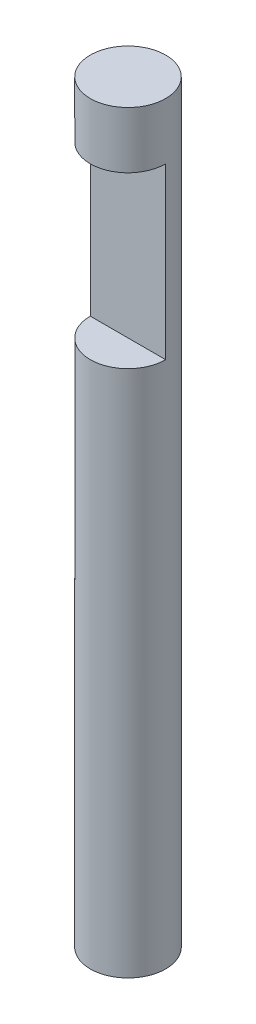
ISO-10303-21;
HEADER;
FILE_DESCRIPTION(('STEP AP214'),'2;1');
FILE_NAME('part.step','',(''),(''),'','','');
FILE_SCHEMA(('AUTOMOTIVE_DESIGN { 1 0 10303 214 1 1 1 1 }'));
ENDSEC;
DATA;
#1=APPLICATION_CONTEXT('core data for automotive mechanical design processes');
#2=APPLICATION_PROTOCOL_DEFINITION('international standard','automotive_design',2000,#1);
#3=PRODUCT_CONTEXT('',#1,'mechanical');
#4=PRODUCT('Part','Part','',(#3));
#5=PRODUCT_RELATED_PRODUCT_CATEGORY('part','',(#4));
#6=PRODUCT_DEFINITION_FORMATION('','',#4);
#7=PRODUCT_DEFINITION_CONTEXT('part definition',#1,'design');
#8=PRODUCT_DEFINITION('design','',#6,#7);
#9=PRODUCT_DEFINITION_SHAPE('','',#8);
#10=(LENGTH_UNIT() NAMED_UNIT(*) SI_UNIT(.MILLI.,.METRE.));
#11=(NAMED_UNIT(*) PLANE_ANGLE_UNIT() SI_UNIT($,.RADIAN.));
#12=(NAMED_UNIT(*) SI_UNIT($,.STERADIAN.) SOLID_ANGLE_UNIT());
#13=UNCERTAINTY_MEASURE_WITH_UNIT(LENGTH_MEASURE(1.E-05),#10,'distance_accuracy_value','');
#14=(GEOMETRIC_REPRESENTATION_CONTEXT(3) GLOBAL_UNCERTAINTY_ASSIGNED_CONTEXT((#13)) GLOBAL_UNIT_ASSIGNED_CONTEXT((#10,
#11,#12)) REPRESENTATION_CONTEXT('',''));
#15=CARTESIAN_POINT('',(0.,0.,0.));
#16=DIRECTION('',(0.,0.,1.));
#17=DIRECTION('',(1.,0.,0.));
#18=AXIS2_PLACEMENT_3D('',#15,#16,#17);
#19=CARTESIAN_POINT('',(0.,28.,0.));
#20=DIRECTION('',(0.,-1.,0.));
#21=DIRECTION('',(0.,0.,-1.));
#22=AXIS2_PLACEMENT_3D('',#19,#20,#21);
#23=CYLINDRICAL_SURFACE('',#22,2.);
#24=CARTESIAN_POINT('',(0.,28.,0.));
#25=DIRECTION('',(0.,1.,0.));
#26=DIRECTION('',(0.,0.,1.));
#27=AXIS2_PLACEMENT_3D('',#24,#25,#26);
#28=CIRCLE('',#27,2.);
#29=CARTESIAN_POINT('',(-2.,28.,0.));
#30=VERTEX_POINT('',#29);
#31=CARTESIAN_POINT('',(2.,28.,0.));
#32=VERTEX_POINT('',#31);
#33=EDGE_CURVE('E11',#30,#32,#28,.T.);
#34=ORIENTED_EDGE('',*,*,#33,.F.);
#35=DIRECTION('',(0.,-1.,0.));
#36=VECTOR('',#35,1.);
#37=CARTESIAN_POINT('',(-2.,37.,0.));
#38=LINE('',#37,#36);
#39=CARTESIAN_POINT('',(-2.,37.,0.));
#40=VERTEX_POINT('',#39);
#41=EDGE_CURVE('E66',#40,#30,#38,.T.);
#42=ORIENTED_EDGE('',*,*,#41,.F.);
#43=CARTESIAN_POINT('',(0.,37.,0.));
#44=DIRECTION('',(0.,1.,0.));
#45=DIRECTION('',(0.,0.,1.));
#46=AXIS2_PLACEMENT_3D('',#43,#44,#45);
#47=CIRCLE('',#46,2.);
#48=CARTESIAN_POINT('',(2.,37.,0.));
#49=VERTEX_POINT('',#48);
#50=EDGE_CURVE('E71',#40,#49,#47,.T.);
#51=ORIENTED_EDGE('',*,*,#50,.T.);
#52=DIRECTION('',(0.,-1.,0.));
#53=VECTOR('',#52,1.);
#54=CARTESIAN_POINT('',(2.,37.,0.));
#55=LINE('',#54,#53);
#56=EDGE_CURVE('E62',#49,#32,#55,.T.);
#57=ORIENTED_EDGE('',*,*,#56,.T.);
#58=EDGE_LOOP('',(#34,#42,#51,#57));
#59=FACE_BOUND('',#58,.T.);
#60=CARTESIAN_POINT('',(0.,0.,0.));
#61=DIRECTION('',(0.,1.,0.));
#62=DIRECTION('',(0.,0.,1.));
#63=AXIS2_PLACEMENT_3D('',#60,#61,#62);
#64=CIRCLE('',#63,2.);
#65=CARTESIAN_POINT('',(0.,0.,2.));
#66=VERTEX_POINT('',#65);
#67=EDGE_CURVE('E39',#66,#66,#64,.T.);
#68=ORIENTED_EDGE('',*,*,#67,.T.);
#69=EDGE_LOOP('',(#68));
#70=FACE_BOUND('',#69,.T.);
#71=CARTESIAN_POINT('',(0.,40.,0.));
#72=DIRECTION('',(0.,1.,0.));
#73=DIRECTION('',(0.,0.,1.));
#74=AXIS2_PLACEMENT_3D('',#71,#72,#73);
#75=CIRCLE('',#74,2.);
#76=CARTESIAN_POINT('',(0.,40.,2.));
#77=VERTEX_POINT('',#76);
#78=EDGE_CURVE('E74',#77,#77,#75,.T.);
#79=ORIENTED_EDGE('',*,*,#78,.F.);
#80=EDGE_LOOP('',(#79));
#81=FACE_BOUND('',#80,.T.);
#82=ADVANCED_FACE('F36',(#59,#70,#81),#23,.T.);
#83=CARTESIAN_POINT('',(0.,28.,0.));
#84=DIRECTION('',(0.,1.,0.));
#85=DIRECTION('',(0.,0.,1.));
#86=AXIS2_PLACEMENT_3D('',#83,#84,#85);
#87=PLANE('',#86);
#88=DIRECTION('',(1.,0.,0.));
#89=VECTOR('',#88,1.);
#90=CARTESIAN_POINT('',(-2.,28.,0.));
#91=LINE('',#90,#89);
#92=EDGE_CURVE('E48',#30,#32,#91,.T.);
#93=ORIENTED_EDGE('',*,*,#92,.F.);
#94=ORIENTED_EDGE('',*,*,#33,.T.);
#95=EDGE_LOOP('',(#93,#94));
#96=FACE_BOUND('',#95,.T.);
#97=ADVANCED_FACE('F86',(#96),#87,.T.);
#98=CARTESIAN_POINT('',(0.,0.,0.));
#99=DIRECTION('',(0.,1.,0.));
#100=DIRECTION('',(0.,0.,1.));
#101=AXIS2_PLACEMENT_3D('',#98,#99,#100);
#102=PLANE('',#101);
#103=ORIENTED_EDGE('',*,*,#67,.F.);
#104=EDGE_LOOP('',(#103));
#105=FACE_BOUND('',#104,.T.);
#106=ADVANCED_FACE('F84',(#105),#102,.F.);
#107=CARTESIAN_POINT('',(-2.,37.,0.));
#108=DIRECTION('',(0.,0.,-1.));
#109=DIRECTION('',(-1.,0.,0.));
#110=AXIS2_PLACEMENT_3D('',#107,#108,#109);
#111=PLANE('',#110);
#112=ORIENTED_EDGE('',*,*,#92,.T.);
#113=ORIENTED_EDGE('',*,*,#56,.F.);
#114=DIRECTION('',(1.,0.,0.));
#115=VECTOR('',#114,1.);
#116=CARTESIAN_POINT('',(-2.,37.,0.));
#117=LINE('',#116,#115);
#118=EDGE_CURVE('E57',#40,#49,#117,.T.);
#119=ORIENTED_EDGE('',*,*,#118,.F.);
#120=ORIENTED_EDGE('',*,*,#41,.T.);
#121=EDGE_LOOP('',(#112,#113,#119,#120));
#122=FACE_BOUND('',#121,.T.);
#123=ADVANCED_FACE('F63',(#122),#111,.F.);
#124=CARTESIAN_POINT('',(0.,37.,0.));
#125=DIRECTION('',(0.,1.,0.));
#126=DIRECTION('',(0.,0.,1.));
#127=AXIS2_PLACEMENT_3D('',#124,#125,#126);
#128=PLANE('',#127);
#129=ORIENTED_EDGE('',*,*,#50,.F.);
#130=ORIENTED_EDGE('',*,*,#118,.T.);
#131=EDGE_LOOP('',(#129,#130));
#132=FACE_BOUND('',#131,.T.);
#133=ADVANCED_FACE('F70',(#132),#128,.F.);
#134=CARTESIAN_POINT('',(0.,40.,0.));
#135=DIRECTION('',(0.,1.,0.));
#136=DIRECTION('',(0.,0.,1.));
#137=AXIS2_PLACEMENT_3D('',#134,#135,#136);
#138=PLANE('',#137);
#139=ORIENTED_EDGE('',*,*,#78,.T.);
#140=EDGE_LOOP('',(#139));
#141=FACE_BOUND('',#140,.T.);
#142=ADVANCED_FACE('F127',(#141),#138,.T.);
#143=CLOSED_SHELL('',(#82,#97,#106,#123,#133,#142));
#144=MANIFOLD_SOLID_BREP('B2',#143);
#145=ADVANCED_BREP_SHAPE_REPRESENTATION('',(#18,#144),#14);
#146=SHAPE_DEFINITION_REPRESENTATION(#9,#145);
ENDSEC;
END-ISO-10303-21;
